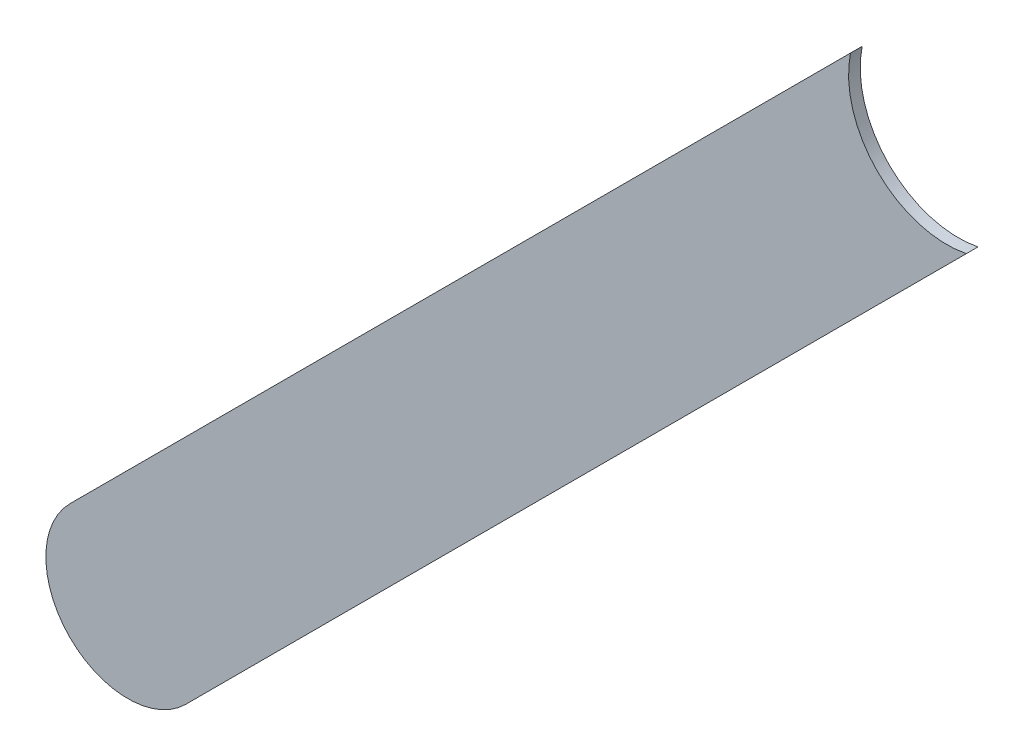
ISO-10303-21;
HEADER;
FILE_DESCRIPTION(('STEP AP214'),'2;1');
FILE_NAME('part.step','',(''),(''),'','','');
FILE_SCHEMA(('AUTOMOTIVE_DESIGN { 1 0 10303 214 1 1 1 1 }'));
ENDSEC;
DATA;
#1=APPLICATION_CONTEXT('core data for automotive mechanical design processes');
#2=APPLICATION_PROTOCOL_DEFINITION('international standard','automotive_design',2000,#1);
#3=PRODUCT_CONTEXT('',#1,'mechanical');
#4=PRODUCT('Part','Part','',(#3));
#5=PRODUCT_RELATED_PRODUCT_CATEGORY('part','',(#4));
#6=PRODUCT_DEFINITION_FORMATION('','',#4);
#7=PRODUCT_DEFINITION_CONTEXT('part definition',#1,'design');
#8=PRODUCT_DEFINITION('design','',#6,#7);
#9=PRODUCT_DEFINITION_SHAPE('','',#8);
#10=(LENGTH_UNIT() NAMED_UNIT(*) SI_UNIT(.MILLI.,.METRE.));
#11=(NAMED_UNIT(*) PLANE_ANGLE_UNIT() SI_UNIT($,.RADIAN.));
#12=(NAMED_UNIT(*) SI_UNIT($,.STERADIAN.) SOLID_ANGLE_UNIT());
#13=UNCERTAINTY_MEASURE_WITH_UNIT(LENGTH_MEASURE(1.E-05),#10,'distance_accuracy_value','');
#14=(GEOMETRIC_REPRESENTATION_CONTEXT(3) GLOBAL_UNCERTAINTY_ASSIGNED_CONTEXT((#13)) GLOBAL_UNIT_ASSIGNED_CONTEXT((#10,
#11,#12)) REPRESENTATION_CONTEXT('',''));
#15=CARTESIAN_POINT('',(0.,0.,0.));
#16=DIRECTION('',(0.,0.,1.));
#17=DIRECTION('',(1.,0.,0.));
#18=AXIS2_PLACEMENT_3D('',#15,#16,#17);
#19=CARTESIAN_POINT('',(85.07678438,85.32323042,0.));
#20=DIRECTION('',(-0.707106781186548,0.707106781186548,0.));
#21=DIRECTION('',(0.707106781186548,0.707106781186548,0.));
#22=AXIS2_PLACEMENT_3D('',#19,#20,#21);
#23=PLANE('',#22);
#24=DIRECTION('',(0.707106781186548,0.707106781186548,0.));
#25=VECTOR('',#24,1.);
#26=CARTESIAN_POINT('',(85.07678438,85.32323042,0.03556));
#27=LINE('',#26,#25);
#28=CARTESIAN_POINT('',(85.07678438,85.32323042,0.03556));
#29=VERTEX_POINT('',#28);
#30=CARTESIAN_POINT('',(87.4594938781994,87.7059399181994,0.03556));
#31=VERTEX_POINT('',#30);
#32=EDGE_CURVE('E11',#29,#31,#27,.T.);
#33=ORIENTED_EDGE('',*,*,#32,.F.);
#34=DIRECTION('',(0.,0.,1.));
#35=VECTOR('',#34,1.);
#36=CARTESIAN_POINT('',(85.07678438,85.32323042,0.));
#37=LINE('',#36,#35);
#38=CARTESIAN_POINT('',(85.07678438,85.32323042,0.));
#39=VERTEX_POINT('',#38);
#40=EDGE_CURVE('E24',#39,#29,#37,.T.);
#41=ORIENTED_EDGE('',*,*,#40,.F.);
#42=DIRECTION('',(0.707106781186548,0.707106781186548,0.));
#43=VECTOR('',#42,1.);
#44=CARTESIAN_POINT('',(85.07678438,85.32323042,0.));
#45=LINE('',#44,#43);
#46=CARTESIAN_POINT('',(87.4594938781994,87.7059399181994,0.));
#47=VERTEX_POINT('',#46);
#48=EDGE_CURVE('E75',#39,#47,#45,.T.);
#49=ORIENTED_EDGE('',*,*,#48,.T.);
#50=DIRECTION('',(0.,0.,1.));
#51=VECTOR('',#50,1.);
#52=CARTESIAN_POINT('',(87.4594938781994,87.7059399181994,0.));
#53=LINE('',#52,#51);
#54=EDGE_CURVE('E37',#47,#31,#53,.T.);
#55=ORIENTED_EDGE('',*,*,#54,.T.);
#56=EDGE_LOOP('',(#33,#41,#49,#55));
#57=FACE_BOUND('',#56,.T.);
#58=ADVANCED_FACE('F17',(#57),#23,.F.);
#59=CARTESIAN_POINT('',(87.3999776,87.9999764,0.));
#60=DIRECTION('',(0.,0.,-1.));
#61=DIRECTION('',(1.,0.,0.));
#62=AXIS2_PLACEMENT_3D('',#59,#60,#61);
#63=CYLINDRICAL_SURFACE('',#62,0.2999994);
#64=DIRECTION('',(0.,0.,1.));
#65=VECTOR('',#64,1.);
#66=CARTESIAN_POINT('',(87.1059411181995,88.0594926781994,0.));
#67=LINE('',#66,#65);
#68=CARTESIAN_POINT('',(87.1059411181995,88.0594926781994,0.));
#69=VERTEX_POINT('',#68);
#70=CARTESIAN_POINT('',(87.1059411181995,88.0594926781994,0.03556));
#71=VERTEX_POINT('',#70);
#72=EDGE_CURVE('E67',#69,#71,#67,.T.);
#73=ORIENTED_EDGE('',*,*,#72,.T.);
#74=CARTESIAN_POINT('',(87.3999776,87.9999764,0.03556));
#75=DIRECTION('',(0.,0.,1.));
#76=DIRECTION('',(1.,0.,0.));
#77=AXIS2_PLACEMENT_3D('',#74,#75,#76);
#78=CIRCLE('',#77,0.2999994);
#79=EDGE_CURVE('E82',#71,#31,#78,.T.);
#80=ORIENTED_EDGE('',*,*,#79,.T.);
#81=ORIENTED_EDGE('',*,*,#54,.F.);
#82=CARTESIAN_POINT('',(87.3999776,87.9999764,0.));
#83=DIRECTION('',(0.,0.,1.));
#84=DIRECTION('',(1.,0.,0.));
#85=AXIS2_PLACEMENT_3D('',#82,#83,#84);
#86=CIRCLE('',#85,0.2999994);
#87=EDGE_CURVE('E80',#69,#47,#86,.T.);
#88=ORIENTED_EDGE('',*,*,#87,.F.);
#89=EDGE_LOOP('',(#73,#80,#81,#88));
#90=FACE_BOUND('',#89,.T.);
#91=ADVANCED_FACE('F88',(#90),#63,.F.);
#92=CARTESIAN_POINT('',(87.1059411181995,88.0594926781994,0.));
#93=DIRECTION('',(0.70710678118655,-0.707106781186546,0.));
#94=DIRECTION('',(-0.707106781186546,-0.70710678118655,0.));
#95=AXIS2_PLACEMENT_3D('',#92,#93,#94);
#96=PLANE('',#95);
#97=DIRECTION('',(-0.707106781186545,-0.70710678118655,0.));
#98=VECTOR('',#97,1.);
#99=CARTESIAN_POINT('',(87.22320122,88.17675278,0.03556));
#100=LINE('',#99,#98);
#101=CARTESIAN_POINT('',(84.72323162,85.67678318,0.03556));
#102=VERTEX_POINT('',#101);
#103=EDGE_CURVE('E71',#71,#102,#100,.T.);
#104=ORIENTED_EDGE('',*,*,#103,.F.);
#105=ORIENTED_EDGE('',*,*,#72,.F.);
#106=DIRECTION('',(-0.707106781186545,-0.70710678118655,0.));
#107=VECTOR('',#106,1.);
#108=CARTESIAN_POINT('',(87.22320122,88.17675278,0.));
#109=LINE('',#108,#107);
#110=CARTESIAN_POINT('',(84.72323162,85.67678318,0.));
#111=VERTEX_POINT('',#110);
#112=EDGE_CURVE('E63',#69,#111,#109,.T.);
#113=ORIENTED_EDGE('',*,*,#112,.T.);
#114=DIRECTION('',(0.,0.,1.));
#115=VECTOR('',#114,1.);
#116=CARTESIAN_POINT('',(84.72323162,85.67678318,0.));
#117=LINE('',#116,#115);
#118=EDGE_CURVE('E53',#111,#102,#117,.T.);
#119=ORIENTED_EDGE('',*,*,#118,.T.);
#120=EDGE_LOOP('',(#104,#105,#113,#119));
#121=FACE_BOUND('',#120,.T.);
#122=ADVANCED_FACE('F66',(#121),#96,.F.);
#123=CARTESIAN_POINT('',(84.900008,85.5000068,0.));
#124=DIRECTION('',(0.,0.,-1.));
#125=DIRECTION('',(-0.707106781186548,0.707106781186548,0.));
#126=AXIS2_PLACEMENT_3D('',#123,#124,#125);
#127=CYLINDRICAL_SURFACE('',#126,0.249999554103209);
#128=CARTESIAN_POINT('',(84.900008,85.5000068,0.03556));
#129=DIRECTION('',(0.,0.,1.));
#130=DIRECTION('',(-0.707106781186548,0.707106781186548,0.));
#131=AXIS2_PLACEMENT_3D('',#128,#129,#130);
#132=CIRCLE('',#131,0.249999554103209);
#133=EDGE_CURVE('E59',#102,#29,#132,.T.);
#134=ORIENTED_EDGE('',*,*,#133,.F.);
#135=ORIENTED_EDGE('',*,*,#118,.F.);
#136=CARTESIAN_POINT('',(84.900008,85.5000068,0.));
#137=DIRECTION('',(0.,0.,1.));
#138=DIRECTION('',(-0.707106781186548,0.707106781186548,0.));
#139=AXIS2_PLACEMENT_3D('',#136,#137,#138);
#140=CIRCLE('',#139,0.249999554103209);
#141=EDGE_CURVE('E57',#111,#39,#140,.T.);
#142=ORIENTED_EDGE('',*,*,#141,.T.);
#143=ORIENTED_EDGE('',*,*,#40,.T.);
#144=EDGE_LOOP('',(#134,#135,#142,#143));
#145=FACE_BOUND('',#144,.T.);
#146=ADVANCED_FACE('F55',(#145),#127,.T.);
#147=CARTESIAN_POINT('',(85.07678438,85.32323042,0.));
#148=DIRECTION('',(0.,0.,-1.));
#149=DIRECTION('',(-1.,0.,0.));
#150=AXIS2_PLACEMENT_3D('',#147,#148,#149);
#151=PLANE('',#150);
#152=ORIENTED_EDGE('',*,*,#48,.F.);
#153=ORIENTED_EDGE('',*,*,#141,.F.);
#154=ORIENTED_EDGE('',*,*,#112,.F.);
#155=ORIENTED_EDGE('',*,*,#87,.T.);
#156=EDGE_LOOP('',(#152,#153,#154,#155));
#157=FACE_BOUND('',#156,.T.);
#158=ADVANCED_FACE('F74',(#157),#151,.T.);
#159=CARTESIAN_POINT('',(85.07678438,85.32323042,0.03556));
#160=DIRECTION('',(0.,0.,-1.));
#161=DIRECTION('',(-1.,0.,0.));
#162=AXIS2_PLACEMENT_3D('',#159,#160,#161);
#163=PLANE('',#162);
#164=ORIENTED_EDGE('',*,*,#133,.T.);
#165=ORIENTED_EDGE('',*,*,#32,.T.);
#166=ORIENTED_EDGE('',*,*,#79,.F.);
#167=ORIENTED_EDGE('',*,*,#103,.T.);
#168=EDGE_LOOP('',(#164,#165,#166,#167));
#169=FACE_BOUND('',#168,.T.);
#170=ADVANCED_FACE('F91',(#169),#163,.F.);
#171=CLOSED_SHELL('',(#58,#91,#122,#146,#158,#170));
#172=MANIFOLD_SOLID_BREP('B1',#171);
#173=ADVANCED_BREP_SHAPE_REPRESENTATION('',(#18,#172),#14);
#174=SHAPE_DEFINITION_REPRESENTATION(#9,#173);
ENDSEC;
END-ISO-10303-21;
